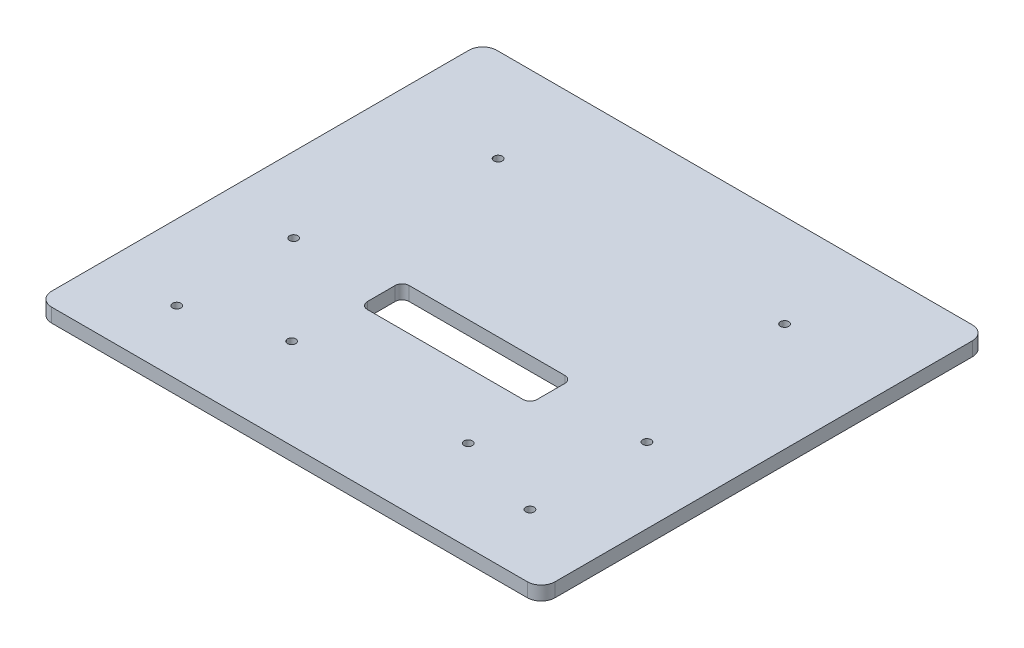
ISO-10303-21;
HEADER;
FILE_DESCRIPTION(('STEP AP214'),'2;1');
FILE_NAME('part.step','',(''),(''),'','','');
FILE_SCHEMA(('AUTOMOTIVE_DESIGN { 1 0 10303 214 1 1 1 1 }'));
ENDSEC;
DATA;
#1=APPLICATION_CONTEXT('core data for automotive mechanical design processes');
#2=APPLICATION_PROTOCOL_DEFINITION('international standard','automotive_design',2000,#1);
#3=PRODUCT_CONTEXT('',#1,'mechanical');
#4=PRODUCT('Part','Part','',(#3));
#5=PRODUCT_RELATED_PRODUCT_CATEGORY('part','',(#4));
#6=PRODUCT_DEFINITION_FORMATION('','',#4);
#7=PRODUCT_DEFINITION_CONTEXT('part definition',#1,'design');
#8=PRODUCT_DEFINITION('design','',#6,#7);
#9=PRODUCT_DEFINITION_SHAPE('','',#8);
#10=(LENGTH_UNIT() NAMED_UNIT(*) SI_UNIT(.MILLI.,.METRE.));
#11=(NAMED_UNIT(*) PLANE_ANGLE_UNIT() SI_UNIT($,.RADIAN.));
#12=(NAMED_UNIT(*) SI_UNIT($,.STERADIAN.) SOLID_ANGLE_UNIT());
#13=UNCERTAINTY_MEASURE_WITH_UNIT(LENGTH_MEASURE(1.E-05),#10,'distance_accuracy_value','');
#14=(GEOMETRIC_REPRESENTATION_CONTEXT(3) GLOBAL_UNCERTAINTY_ASSIGNED_CONTEXT((#13)) GLOBAL_UNIT_ASSIGNED_CONTEXT((#10,
#11,#12)) REPRESENTATION_CONTEXT('',''));
#15=CARTESIAN_POINT('',(0.,0.,0.));
#16=DIRECTION('',(0.,0.,1.));
#17=DIRECTION('',(1.,0.,0.));
#18=AXIS2_PLACEMENT_3D('',#15,#16,#17);
#19=CARTESIAN_POINT('',(109.134216211139,5.,-126.661644013292));
#20=DIRECTION('',(0.,-1.,0.));
#21=DIRECTION('',(0.,0.,-1.));
#22=AXIS2_PLACEMENT_3D('',#19,#20,#21);
#23=CYLINDRICAL_SURFACE('',#22,5.00000000000001);
#24=CARTESIAN_POINT('',(109.134216211139,0.,-126.661644013292));
#25=DIRECTION('',(0.,1.,0.));
#26=DIRECTION('',(0.,0.,-1.));
#27=AXIS2_PLACEMENT_3D('',#24,#25,#26);
#28=CIRCLE('',#27,5.00000000000001);
#29=CARTESIAN_POINT('',(114.134216211139,0.,-126.661644013292));
#30=VERTEX_POINT('',#29);
#31=CARTESIAN_POINT('',(109.134216211139,0.,-131.661644013292));
#32=VERTEX_POINT('',#31);
#33=EDGE_CURVE('E232',#30,#32,#28,.T.);
#34=ORIENTED_EDGE('',*,*,#33,.T.);
#35=DIRECTION('',(0.,-1.,0.));
#36=VECTOR('',#35,1.);
#37=CARTESIAN_POINT('',(109.134216211139,5.,-131.661644013292));
#38=LINE('',#37,#36);
#39=CARTESIAN_POINT('',(109.134216211139,5.,-131.661644013292));
#40=VERTEX_POINT('',#39);
#41=EDGE_CURVE('E289',#40,#32,#38,.T.);
#42=ORIENTED_EDGE('',*,*,#41,.F.);
#43=CARTESIAN_POINT('',(109.134216211139,5.,-126.661644013292));
#44=DIRECTION('',(0.,1.,0.));
#45=DIRECTION('',(0.,0.,-1.));
#46=AXIS2_PLACEMENT_3D('',#43,#44,#45);
#47=CIRCLE('',#46,5.00000000000001);
#48=CARTESIAN_POINT('',(114.134216211139,5.,-126.661644013292));
#49=VERTEX_POINT('',#48);
#50=EDGE_CURVE('E235',#49,#40,#47,.T.);
#51=ORIENTED_EDGE('',*,*,#50,.F.);
#52=DIRECTION('',(0.,-1.,0.));
#53=VECTOR('',#52,1.);
#54=CARTESIAN_POINT('',(114.134216211139,5.,-126.661644013292));
#55=LINE('',#54,#53);
#56=EDGE_CURVE('E253',#49,#30,#55,.T.);
#57=ORIENTED_EDGE('',*,*,#56,.T.);
#58=EDGE_LOOP('',(#34,#42,#51,#57));
#59=FACE_BOUND('',#58,.T.);
#60=ADVANCED_FACE('F35',(#59),#23,.T.);
#61=CARTESIAN_POINT('',(-61.8657837888607,5.,-131.661644013292));
#62=DIRECTION('',(0.,0.,1.));
#63=DIRECTION('',(1.,0.,0.));
#64=AXIS2_PLACEMENT_3D('',#61,#62,#63);
#65=PLANE('',#64);
#66=DIRECTION('',(-1.,0.,0.));
#67=VECTOR('',#66,1.);
#68=CARTESIAN_POINT('',(-61.8657837888607,0.,-131.661644013292));
#69=LINE('',#68,#67);
#70=CARTESIAN_POINT('',(-61.8657837888607,0.,-131.661644013292));
#71=VERTEX_POINT('',#70);
#72=EDGE_CURVE('E256',#32,#71,#69,.T.);
#73=ORIENTED_EDGE('',*,*,#72,.T.);
#74=DIRECTION('',(0.,-1.,0.));
#75=VECTOR('',#74,1.);
#76=CARTESIAN_POINT('',(-61.8657837888607,5.,-131.661644013292));
#77=LINE('',#76,#75);
#78=CARTESIAN_POINT('',(-61.8657837888607,5.,-131.661644013292));
#79=VERTEX_POINT('',#78);
#80=EDGE_CURVE('E286',#79,#71,#77,.T.);
#81=ORIENTED_EDGE('',*,*,#80,.F.);
#82=DIRECTION('',(-1.,0.,0.));
#83=VECTOR('',#82,1.);
#84=CARTESIAN_POINT('',(-61.8657837888607,5.,-131.661644013292));
#85=LINE('',#84,#83);
#86=EDGE_CURVE('E238',#40,#79,#85,.T.);
#87=ORIENTED_EDGE('',*,*,#86,.F.);
#88=ORIENTED_EDGE('',*,*,#41,.T.);
#89=EDGE_LOOP('',(#73,#81,#87,#88));
#90=FACE_BOUND('',#89,.T.);
#91=ADVANCED_FACE('F352',(#90),#65,.F.);
#92=CARTESIAN_POINT('',(-61.8657837888607,5.,-126.661644013292));
#93=DIRECTION('',(0.,-1.,0.));
#94=DIRECTION('',(0.,0.,-1.));
#95=AXIS2_PLACEMENT_3D('',#92,#93,#94);
#96=CYLINDRICAL_SURFACE('',#95,4.99999999999999);
#97=CARTESIAN_POINT('',(-61.8657837888607,0.,-126.661644013292));
#98=DIRECTION('',(0.,1.,0.));
#99=DIRECTION('',(0.,0.,1.));
#100=AXIS2_PLACEMENT_3D('',#97,#98,#99);
#101=CIRCLE('',#100,4.99999999999999);
#102=CARTESIAN_POINT('',(-66.8657837888607,0.,-126.661644013292));
#103=VERTEX_POINT('',#102);
#104=EDGE_CURVE('E258',#71,#103,#101,.T.);
#105=ORIENTED_EDGE('',*,*,#104,.T.);
#106=DIRECTION('',(0.,-1.,0.));
#107=VECTOR('',#106,1.);
#108=CARTESIAN_POINT('',(-66.8657837888607,5.,-126.661644013292));
#109=LINE('',#108,#107);
#110=CARTESIAN_POINT('',(-66.8657837888607,5.,-126.661644013292));
#111=VERTEX_POINT('',#110);
#112=EDGE_CURVE('E283',#111,#103,#109,.T.);
#113=ORIENTED_EDGE('',*,*,#112,.F.);
#114=CARTESIAN_POINT('',(-61.8657837888607,5.,-126.661644013292));
#115=DIRECTION('',(0.,1.,0.));
#116=DIRECTION('',(0.,0.,1.));
#117=AXIS2_PLACEMENT_3D('',#114,#115,#116);
#118=CIRCLE('',#117,4.99999999999999);
#119=EDGE_CURVE('E241',#79,#111,#118,.T.);
#120=ORIENTED_EDGE('',*,*,#119,.F.);
#121=ORIENTED_EDGE('',*,*,#80,.T.);
#122=EDGE_LOOP('',(#105,#113,#120,#121));
#123=FACE_BOUND('',#122,.T.);
#124=ADVANCED_FACE('F357',(#123),#96,.T.);
#125=CARTESIAN_POINT('',(-66.8657837888607,5.,-126.661644013292));
#126=DIRECTION('',(1.,0.,0.));
#127=DIRECTION('',(0.,0.,-1.));
#128=AXIS2_PLACEMENT_3D('',#125,#126,#127);
#129=PLANE('',#128);
#130=DIRECTION('',(0.,0.,1.));
#131=VECTOR('',#130,1.);
#132=CARTESIAN_POINT('',(-66.8657837888607,0.,-126.661644013292));
#133=LINE('',#132,#131);
#134=CARTESIAN_POINT('',(-66.8657837888607,0.,23.3383559867076));
#135=VERTEX_POINT('',#134);
#136=EDGE_CURVE('E260',#103,#135,#133,.T.);
#137=ORIENTED_EDGE('',*,*,#136,.T.);
#138=DIRECTION('',(0.,-1.,0.));
#139=VECTOR('',#138,1.);
#140=CARTESIAN_POINT('',(-66.8657837888607,5.,23.3383559867076));
#141=LINE('',#140,#139);
#142=CARTESIAN_POINT('',(-66.8657837888607,5.,23.3383559867076));
#143=VERTEX_POINT('',#142);
#144=EDGE_CURVE('E280',#143,#135,#141,.T.);
#145=ORIENTED_EDGE('',*,*,#144,.F.);
#146=DIRECTION('',(0.,0.,1.));
#147=VECTOR('',#146,1.);
#148=CARTESIAN_POINT('',(-66.8657837888607,5.,-126.661644013292));
#149=LINE('',#148,#147);
#150=EDGE_CURVE('E243',#111,#143,#149,.T.);
#151=ORIENTED_EDGE('',*,*,#150,.F.);
#152=ORIENTED_EDGE('',*,*,#112,.T.);
#153=EDGE_LOOP('',(#137,#145,#151,#152));
#154=FACE_BOUND('',#153,.T.);
#155=ADVANCED_FACE('F391',(#154),#129,.F.);
#156=CARTESIAN_POINT('',(-61.8657837888607,5.,23.3383559867076));
#157=DIRECTION('',(0.,-1.,0.));
#158=DIRECTION('',(0.,0.,-1.));
#159=AXIS2_PLACEMENT_3D('',#156,#157,#158);
#160=CYLINDRICAL_SURFACE('',#159,5.);
#161=CARTESIAN_POINT('',(-61.8657837888607,0.,23.3383559867076));
#162=DIRECTION('',(0.,1.,0.));
#163=DIRECTION('',(0.,0.,-1.));
#164=AXIS2_PLACEMENT_3D('',#161,#162,#163);
#165=CIRCLE('',#164,5.);
#166=CARTESIAN_POINT('',(-61.8657837888607,0.,28.3383559867076));
#167=VERTEX_POINT('',#166);
#168=EDGE_CURVE('E262',#135,#167,#165,.T.);
#169=ORIENTED_EDGE('',*,*,#168,.T.);
#170=DIRECTION('',(0.,-1.,0.));
#171=VECTOR('',#170,1.);
#172=CARTESIAN_POINT('',(-61.8657837888607,5.,28.3383559867076));
#173=LINE('',#172,#171);
#174=CARTESIAN_POINT('',(-61.8657837888607,5.,28.3383559867076));
#175=VERTEX_POINT('',#174);
#176=EDGE_CURVE('E277',#175,#167,#173,.T.);
#177=ORIENTED_EDGE('',*,*,#176,.F.);
#178=CARTESIAN_POINT('',(-61.8657837888607,5.,23.3383559867076));
#179=DIRECTION('',(0.,1.,0.));
#180=DIRECTION('',(0.,0.,-1.));
#181=AXIS2_PLACEMENT_3D('',#178,#179,#180);
#182=CIRCLE('',#181,5.);
#183=EDGE_CURVE('E245',#143,#175,#182,.T.);
#184=ORIENTED_EDGE('',*,*,#183,.F.);
#185=ORIENTED_EDGE('',*,*,#144,.T.);
#186=EDGE_LOOP('',(#169,#177,#184,#185));
#187=FACE_BOUND('',#186,.T.);
#188=ADVANCED_FACE('F387',(#187),#160,.T.);
#189=CARTESIAN_POINT('',(-61.8657837888607,5.,28.3383559867076));
#190=DIRECTION('',(0.,0.,-1.));
#191=DIRECTION('',(-1.,0.,0.));
#192=AXIS2_PLACEMENT_3D('',#189,#190,#191);
#193=PLANE('',#192);
#194=DIRECTION('',(1.,0.,0.));
#195=VECTOR('',#194,1.);
#196=CARTESIAN_POINT('',(-61.8657837888607,0.,28.3383559867076));
#197=LINE('',#196,#195);
#198=CARTESIAN_POINT('',(109.134216211139,0.,28.3383559867076));
#199=VERTEX_POINT('',#198);
#200=EDGE_CURVE('E264',#167,#199,#197,.T.);
#201=ORIENTED_EDGE('',*,*,#200,.T.);
#202=DIRECTION('',(0.,-1.,0.));
#203=VECTOR('',#202,1.);
#204=CARTESIAN_POINT('',(109.134216211139,5.,28.3383559867076));
#205=LINE('',#204,#203);
#206=CARTESIAN_POINT('',(109.134216211139,5.,28.3383559867076));
#207=VERTEX_POINT('',#206);
#208=EDGE_CURVE('E274',#207,#199,#205,.T.);
#209=ORIENTED_EDGE('',*,*,#208,.F.);
#210=DIRECTION('',(1.,0.,0.));
#211=VECTOR('',#210,1.);
#212=CARTESIAN_POINT('',(-61.8657837888607,5.,28.3383559867076));
#213=LINE('',#212,#211);
#214=EDGE_CURVE('E247',#175,#207,#213,.T.);
#215=ORIENTED_EDGE('',*,*,#214,.F.);
#216=ORIENTED_EDGE('',*,*,#176,.T.);
#217=EDGE_LOOP('',(#201,#209,#215,#216));
#218=FACE_BOUND('',#217,.T.);
#219=ADVANCED_FACE('F382',(#218),#193,.F.);
#220=CARTESIAN_POINT('',(109.134216211139,5.,23.3383559867076));
#221=DIRECTION('',(0.,-1.,0.));
#222=DIRECTION('',(0.,0.,-1.));
#223=AXIS2_PLACEMENT_3D('',#220,#221,#222);
#224=CYLINDRICAL_SURFACE('',#223,5.);
#225=CARTESIAN_POINT('',(109.134216211139,0.,23.3383559867076));
#226=DIRECTION('',(0.,1.,0.));
#227=DIRECTION('',(0.,0.,1.));
#228=AXIS2_PLACEMENT_3D('',#225,#226,#227);
#229=CIRCLE('',#228,5.);
#230=CARTESIAN_POINT('',(114.134216211139,0.,23.3383559867076));
#231=VERTEX_POINT('',#230);
#232=EDGE_CURVE('E266',#199,#231,#229,.T.);
#233=ORIENTED_EDGE('',*,*,#232,.T.);
#234=DIRECTION('',(0.,-1.,0.));
#235=VECTOR('',#234,1.);
#236=CARTESIAN_POINT('',(114.134216211139,5.,23.3383559867076));
#237=LINE('',#236,#235);
#238=CARTESIAN_POINT('',(114.134216211139,5.,23.3383559867076));
#239=VERTEX_POINT('',#238);
#240=EDGE_CURVE('E271',#239,#231,#237,.T.);
#241=ORIENTED_EDGE('',*,*,#240,.F.);
#242=CARTESIAN_POINT('',(109.134216211139,5.,23.3383559867076));
#243=DIRECTION('',(0.,1.,0.));
#244=DIRECTION('',(0.,0.,1.));
#245=AXIS2_PLACEMENT_3D('',#242,#243,#244);
#246=CIRCLE('',#245,5.);
#247=EDGE_CURVE('E249',#207,#239,#246,.T.);
#248=ORIENTED_EDGE('',*,*,#247,.F.);
#249=ORIENTED_EDGE('',*,*,#208,.T.);
#250=EDGE_LOOP('',(#233,#241,#248,#249));
#251=FACE_BOUND('',#250,.T.);
#252=ADVANCED_FACE('F377',(#251),#224,.T.);
#253=CARTESIAN_POINT('',(114.134216211139,5.,-126.661644013292));
#254=DIRECTION('',(-1.,0.,0.));
#255=DIRECTION('',(0.,0.,1.));
#256=AXIS2_PLACEMENT_3D('',#253,#254,#255);
#257=PLANE('',#256);
#258=DIRECTION('',(0.,0.,-1.));
#259=VECTOR('',#258,1.);
#260=CARTESIAN_POINT('',(114.134216211139,0.,-126.661644013292));
#261=LINE('',#260,#259);
#262=EDGE_CURVE('E239',#231,#30,#261,.T.);
#263=ORIENTED_EDGE('',*,*,#262,.T.);
#264=ORIENTED_EDGE('',*,*,#56,.F.);
#265=DIRECTION('',(0.,0.,-1.));
#266=VECTOR('',#265,1.);
#267=CARTESIAN_POINT('',(114.134216211139,5.,-126.661644013292));
#268=LINE('',#267,#266);
#269=EDGE_CURVE('E251',#239,#49,#268,.T.);
#270=ORIENTED_EDGE('',*,*,#269,.F.);
#271=ORIENTED_EDGE('',*,*,#240,.T.);
#272=EDGE_LOOP('',(#263,#264,#270,#271));
#273=FACE_BOUND('',#272,.T.);
#274=ADVANCED_FACE('F375',(#273),#257,.F.);
#275=CARTESIAN_POINT('',(109.134216211139,5.,-126.661644013292));
#276=DIRECTION('',(0.,-1.,0.));
#277=DIRECTION('',(0.,0.,-1.));
#278=AXIS2_PLACEMENT_3D('',#275,#276,#277);
#279=PLANE('',#278);
#280=DIRECTION('',(-1.,0.,0.));
#281=VECTOR('',#280,1.);
#282=CARTESIAN_POINT('',(-4.36578378886072,5.,-42.6616440132924));
#283=LINE('',#282,#281);
#284=CARTESIAN_POINT('',(51.6342162111393,5.,-42.6616440132924));
#285=VERTEX_POINT('',#284);
#286=CARTESIAN_POINT('',(-4.36578378886072,5.,-42.6616440132924));
#287=VERTEX_POINT('',#286);
#288=EDGE_CURVE('E158',#285,#287,#283,.T.);
#289=ORIENTED_EDGE('',*,*,#288,.F.);
#290=CARTESIAN_POINT('',(51.6342162111393,5.,-40.1616440132924));
#291=DIRECTION('',(0.,1.,0.));
#292=DIRECTION('',(0.,0.,1.));
#293=AXIS2_PLACEMENT_3D('',#290,#291,#292);
#294=CIRCLE('',#293,2.5);
#295=CARTESIAN_POINT('',(54.1342162111393,5.,-40.1616440132924));
#296=VERTEX_POINT('',#295);
#297=EDGE_CURVE('E49',#296,#285,#294,.T.);
#298=ORIENTED_EDGE('',*,*,#297,.F.);
#299=DIRECTION('',(0.,0.,-1.));
#300=VECTOR('',#299,1.);
#301=CARTESIAN_POINT('',(54.1342162111393,5.,-40.1616440132924));
#302=LINE('',#301,#300);
#303=CARTESIAN_POINT('',(54.1342162111393,5.,-30.1616440132924));
#304=VERTEX_POINT('',#303);
#305=EDGE_CURVE('E180',#304,#296,#302,.T.);
#306=ORIENTED_EDGE('',*,*,#305,.F.);
#307=CARTESIAN_POINT('',(51.6342162111393,5.,-30.1616440132924));
#308=DIRECTION('',(0.,1.,0.));
#309=DIRECTION('',(0.,0.,-1.));
#310=AXIS2_PLACEMENT_3D('',#307,#308,#309);
#311=CIRCLE('',#310,2.5);
#312=CARTESIAN_POINT('',(51.6342162111393,5.,-27.6616440132924));
#313=VERTEX_POINT('',#312);
#314=EDGE_CURVE('E177',#313,#304,#311,.T.);
#315=ORIENTED_EDGE('',*,*,#314,.F.);
#316=DIRECTION('',(1.,0.,0.));
#317=VECTOR('',#316,1.);
#318=CARTESIAN_POINT('',(-4.36578378886072,5.,-27.6616440132924));
#319=LINE('',#318,#317);
#320=CARTESIAN_POINT('',(-4.36578378886072,5.,-27.6616440132924));
#321=VERTEX_POINT('',#320);
#322=EDGE_CURVE('E174',#321,#313,#319,.T.);
#323=ORIENTED_EDGE('',*,*,#322,.F.);
#324=CARTESIAN_POINT('',(-4.36578378886074,5.,-30.1616440132924));
#325=DIRECTION('',(0.,1.,0.));
#326=DIRECTION('',(0.,0.,-1.));
#327=AXIS2_PLACEMENT_3D('',#324,#325,#326);
#328=CIRCLE('',#327,2.5);
#329=CARTESIAN_POINT('',(-6.86578378886074,5.,-30.1616440132924));
#330=VERTEX_POINT('',#329);
#331=EDGE_CURVE('E168',#330,#321,#328,.T.);
#332=ORIENTED_EDGE('',*,*,#331,.F.);
#333=DIRECTION('',(0.,0.,1.));
#334=VECTOR('',#333,1.);
#335=CARTESIAN_POINT('',(-6.86578378886074,5.,-40.1616440132924));
#336=LINE('',#335,#334);
#337=CARTESIAN_POINT('',(-6.86578378886074,5.,-40.1616440132924));
#338=VERTEX_POINT('',#337);
#339=EDGE_CURVE('E166',#338,#330,#336,.T.);
#340=ORIENTED_EDGE('',*,*,#339,.F.);
#341=CARTESIAN_POINT('',(-4.36578378886074,5.,-40.1616440132924));
#342=DIRECTION('',(0.,1.,0.));
#343=DIRECTION('',(0.,0.,1.));
#344=AXIS2_PLACEMENT_3D('',#341,#342,#343);
#345=CIRCLE('',#344,2.5);
#346=EDGE_CURVE('E149',#287,#338,#345,.T.);
#347=ORIENTED_EDGE('',*,*,#346,.F.);
#348=EDGE_LOOP('',(#289,#298,#306,#315,#323,#332,#340,#347));
#349=FACE_BOUND('',#348,.T.);
#350=CARTESIAN_POINT('',(-39.8657837888607,5.,5.38835598670764));
#351=DIRECTION('',(0.,1.,0.));
#352=DIRECTION('',(0.,0.,1.));
#353=AXIS2_PLACEMENT_3D('',#350,#351,#352);
#354=CIRCLE('',#353,1.5);
#355=CARTESIAN_POINT('',(-39.8657837888607,5.,6.88835598670764));
#356=VERTEX_POINT('',#355);
#357=EDGE_CURVE('E196',#356,#356,#354,.T.);
#358=ORIENTED_EDGE('',*,*,#357,.F.);
#359=EDGE_LOOP('',(#358));
#360=FACE_BOUND('',#359,.T.);
#361=CARTESIAN_POINT('',(87.1342162111393,5.,-36.6616440132924));
#362=DIRECTION('',(0.,1.,0.));
#363=DIRECTION('',(0.,0.,1.));
#364=AXIS2_PLACEMENT_3D('',#361,#362,#363);
#365=CIRCLE('',#364,1.5);
#366=CARTESIAN_POINT('',(87.1342162111393,5.,-35.1616440132924));
#367=VERTEX_POINT('',#366);
#368=EDGE_CURVE('E200',#367,#367,#365,.T.);
#369=ORIENTED_EDGE('',*,*,#368,.F.);
#370=EDGE_LOOP('',(#369));
#371=FACE_BOUND('',#370,.T.);
#372=CARTESIAN_POINT('',(87.1342162111393,5.,5.38835598670764));
#373=DIRECTION('',(0.,1.,0.));
#374=DIRECTION('',(0.,0.,1.));
#375=AXIS2_PLACEMENT_3D('',#372,#373,#374);
#376=CIRCLE('',#375,1.5);
#377=CARTESIAN_POINT('',(87.1342162111393,5.,6.88835598670763));
#378=VERTEX_POINT('',#377);
#379=EDGE_CURVE('E185',#378,#378,#376,.T.);
#380=ORIENTED_EDGE('',*,*,#379,.F.);
#381=EDGE_LOOP('',(#380));
#382=FACE_BOUND('',#381,.T.);
#383=CARTESIAN_POINT('',(-39.8657837888607,5.,-36.6616440132924));
#384=DIRECTION('',(0.,1.,0.));
#385=DIRECTION('',(0.,0.,1.));
#386=AXIS2_PLACEMENT_3D('',#383,#384,#385);
#387=CIRCLE('',#386,1.5);
#388=CARTESIAN_POINT('',(-39.8657837888607,5.,-35.1616440132924));
#389=VERTEX_POINT('',#388);
#390=EDGE_CURVE('E205',#389,#389,#387,.T.);
#391=ORIENTED_EDGE('',*,*,#390,.F.);
#392=EDGE_LOOP('',(#391));
#393=FACE_BOUND('',#392,.T.);
#394=CARTESIAN_POINT('',(75.1342162111393,5.,-98.1616440132924));
#395=DIRECTION('',(0.,1.,0.));
#396=DIRECTION('',(0.,0.,1.));
#397=AXIS2_PLACEMENT_3D('',#394,#395,#396);
#398=CIRCLE('',#397,1.5);
#399=CARTESIAN_POINT('',(75.1342162111393,5.,-96.6616440132924));
#400=VERTEX_POINT('',#399);
#401=EDGE_CURVE('E214',#400,#400,#398,.T.);
#402=ORIENTED_EDGE('',*,*,#401,.F.);
#403=EDGE_LOOP('',(#402));
#404=FACE_BOUND('',#403,.T.);
#405=CARTESIAN_POINT('',(-8.11578378886073,5.,-4.16164401329237));
#406=DIRECTION('',(0.,1.,0.));
#407=DIRECTION('',(0.,0.,1.));
#408=AXIS2_PLACEMENT_3D('',#405,#406,#407);
#409=CIRCLE('',#408,1.5);
#410=CARTESIAN_POINT('',(-8.11578378886073,5.,-2.66164401329237));
#411=VERTEX_POINT('',#410);
#412=EDGE_CURVE('E220',#411,#411,#409,.T.);
#413=ORIENTED_EDGE('',*,*,#412,.F.);
#414=EDGE_LOOP('',(#413));
#415=FACE_BOUND('',#414,.T.);
#416=CARTESIAN_POINT('',(55.3842162111393,5.,-4.16164401329237));
#417=DIRECTION('',(0.,1.,0.));
#418=DIRECTION('',(0.,0.,1.));
#419=AXIS2_PLACEMENT_3D('',#416,#417,#418);
#420=CIRCLE('',#419,1.5);
#421=CARTESIAN_POINT('',(55.3842162111393,5.,-2.66164401329237));
#422=VERTEX_POINT('',#421);
#423=EDGE_CURVE('E226',#422,#422,#420,.T.);
#424=ORIENTED_EDGE('',*,*,#423,.F.);
#425=EDGE_LOOP('',(#424));
#426=FACE_BOUND('',#425,.T.);
#427=CARTESIAN_POINT('',(-27.8657837888607,5.,-98.1616440132924));
#428=DIRECTION('',(0.,1.,0.));
#429=DIRECTION('',(0.,0.,1.));
#430=AXIS2_PLACEMENT_3D('',#427,#428,#429);
#431=CIRCLE('',#430,1.5);
#432=CARTESIAN_POINT('',(-27.8657837888607,5.,-96.6616440132924));
#433=VERTEX_POINT('',#432);
#434=EDGE_CURVE('E213',#433,#433,#431,.T.);
#435=ORIENTED_EDGE('',*,*,#434,.F.);
#436=EDGE_LOOP('',(#435));
#437=FACE_BOUND('',#436,.T.);
#438=ORIENTED_EDGE('',*,*,#50,.T.);
#439=ORIENTED_EDGE('',*,*,#86,.T.);
#440=ORIENTED_EDGE('',*,*,#119,.T.);
#441=ORIENTED_EDGE('',*,*,#150,.T.);
#442=ORIENTED_EDGE('',*,*,#183,.T.);
#443=ORIENTED_EDGE('',*,*,#214,.T.);
#444=ORIENTED_EDGE('',*,*,#247,.T.);
#445=ORIENTED_EDGE('',*,*,#269,.T.);
#446=EDGE_LOOP('',(#438,#439,#440,#441,#442,#443,#444,#445));
#447=FACE_BOUND('',#446,.T.);
#448=ADVANCED_FACE('F162',(#349,#360,#371,#382,#393,#404,#415,#426,#437,#447),#279,.F.);
#449=CARTESIAN_POINT('',(109.134216211139,0.,-126.661644013292));
#450=DIRECTION('',(0.,-1.,0.));
#451=DIRECTION('',(0.,0.,-1.));
#452=AXIS2_PLACEMENT_3D('',#449,#450,#451);
#453=PLANE('',#452);
#454=CARTESIAN_POINT('',(51.6342162111393,0.,-40.1616440132924));
#455=DIRECTION('',(0.,-1.,0.));
#456=DIRECTION('',(0.,0.,-1.));
#457=AXIS2_PLACEMENT_3D('',#454,#455,#456);
#458=CIRCLE('',#457,2.5);
#459=CARTESIAN_POINT('',(51.6342162111393,0.,-42.6616440132924));
#460=VERTEX_POINT('',#459);
#461=CARTESIAN_POINT('',(54.1342162111393,0.,-40.1616440132924));
#462=VERTEX_POINT('',#461);
#463=EDGE_CURVE('E11',#460,#462,#458,.T.);
#464=ORIENTED_EDGE('',*,*,#463,.F.);
#465=DIRECTION('',(1.,0.,0.));
#466=VECTOR('',#465,1.);
#467=CARTESIAN_POINT('',(109.134216211139,0.,-42.6616440132924));
#468=LINE('',#467,#466);
#469=CARTESIAN_POINT('',(-4.36578378886072,0.,-42.6616440132924));
#470=VERTEX_POINT('',#469);
#471=EDGE_CURVE('E292',#470,#460,#468,.T.);
#472=ORIENTED_EDGE('',*,*,#471,.F.);
#473=CARTESIAN_POINT('',(-4.36578378886074,0.,-40.1616440132924));
#474=DIRECTION('',(0.,-1.,0.));
#475=DIRECTION('',(0.,0.,-1.));
#476=AXIS2_PLACEMENT_3D('',#473,#474,#475);
#477=CIRCLE('',#476,2.5);
#478=CARTESIAN_POINT('',(-6.86578378886074,0.,-40.1616440132924));
#479=VERTEX_POINT('',#478);
#480=EDGE_CURVE('E152',#479,#470,#477,.T.);
#481=ORIENTED_EDGE('',*,*,#480,.F.);
#482=DIRECTION('',(0.,0.,-1.));
#483=VECTOR('',#482,1.);
#484=CARTESIAN_POINT('',(-6.86578378886075,0.,-126.661644013292));
#485=LINE('',#484,#483);
#486=CARTESIAN_POINT('',(-6.86578378886074,0.,-30.1616440132924));
#487=VERTEX_POINT('',#486);
#488=EDGE_CURVE('E304',#487,#479,#485,.T.);
#489=ORIENTED_EDGE('',*,*,#488,.F.);
#490=CARTESIAN_POINT('',(-4.36578378886074,0.,-30.1616440132924));
#491=DIRECTION('',(0.,-1.,0.));
#492=DIRECTION('',(0.,0.,-1.));
#493=AXIS2_PLACEMENT_3D('',#490,#491,#492);
#494=CIRCLE('',#493,2.5);
#495=CARTESIAN_POINT('',(-4.36578378886072,0.,-27.6616440132924));
#496=VERTEX_POINT('',#495);
#497=EDGE_CURVE('E306',#496,#487,#494,.T.);
#498=ORIENTED_EDGE('',*,*,#497,.F.);
#499=DIRECTION('',(-1.,0.,0.));
#500=VECTOR('',#499,1.);
#501=CARTESIAN_POINT('',(109.134216211139,0.,-27.6616440132924));
#502=LINE('',#501,#500);
#503=CARTESIAN_POINT('',(51.6342162111393,0.,-27.6616440132924));
#504=VERTEX_POINT('',#503);
#505=EDGE_CURVE('E308',#504,#496,#502,.T.);
#506=ORIENTED_EDGE('',*,*,#505,.F.);
#507=CARTESIAN_POINT('',(51.6342162111393,0.,-30.1616440132924));
#508=DIRECTION('',(0.,-1.,0.));
#509=DIRECTION('',(0.,0.,-1.));
#510=AXIS2_PLACEMENT_3D('',#507,#508,#509);
#511=CIRCLE('',#510,2.5);
#512=CARTESIAN_POINT('',(54.1342162111393,0.,-30.1616440132924));
#513=VERTEX_POINT('',#512);
#514=EDGE_CURVE('E310',#513,#504,#511,.T.);
#515=ORIENTED_EDGE('',*,*,#514,.F.);
#516=DIRECTION('',(0.,0.,1.));
#517=VECTOR('',#516,1.);
#518=CARTESIAN_POINT('',(54.1342162111393,0.,-126.661644013292));
#519=LINE('',#518,#517);
#520=EDGE_CURVE('E42',#462,#513,#519,.T.);
#521=ORIENTED_EDGE('',*,*,#520,.F.);
#522=EDGE_LOOP('',(#464,#472,#481,#489,#498,#506,#515,#521));
#523=FACE_BOUND('',#522,.T.);
#524=CARTESIAN_POINT('',(-39.8657837888607,0.,5.38835598670764));
#525=DIRECTION('',(0.,-1.,0.));
#526=DIRECTION('',(0.,0.,-1.));
#527=AXIS2_PLACEMENT_3D('',#524,#525,#526);
#528=CIRCLE('',#527,1.5);
#529=CARTESIAN_POINT('',(-39.8657837888607,0.,3.88835598670763));
#530=VERTEX_POINT('',#529);
#531=EDGE_CURVE('E209',#530,#530,#528,.T.);
#532=ORIENTED_EDGE('',*,*,#531,.F.);
#533=EDGE_LOOP('',(#532));
#534=FACE_BOUND('',#533,.T.);
#535=CARTESIAN_POINT('',(87.1342162111393,0.,-36.6616440132924));
#536=DIRECTION('',(0.,-1.,0.));
#537=DIRECTION('',(0.,0.,-1.));
#538=AXIS2_PLACEMENT_3D('',#535,#536,#537);
#539=CIRCLE('',#538,1.5);
#540=CARTESIAN_POINT('',(87.1342162111393,0.,-38.1616440132924));
#541=VERTEX_POINT('',#540);
#542=EDGE_CURVE('E297',#541,#541,#539,.T.);
#543=ORIENTED_EDGE('',*,*,#542,.F.);
#544=EDGE_LOOP('',(#543));
#545=FACE_BOUND('',#544,.T.);
#546=CARTESIAN_POINT('',(87.1342162111393,0.,5.38835598670764));
#547=DIRECTION('',(0.,-1.,0.));
#548=DIRECTION('',(0.,0.,-1.));
#549=AXIS2_PLACEMENT_3D('',#546,#547,#548);
#550=CIRCLE('',#549,1.5);
#551=CARTESIAN_POINT('',(87.1342162111393,0.,3.88835598670764));
#552=VERTEX_POINT('',#551);
#553=EDGE_CURVE('E199',#552,#552,#550,.T.);
#554=ORIENTED_EDGE('',*,*,#553,.F.);
#555=EDGE_LOOP('',(#554));
#556=FACE_BOUND('',#555,.T.);
#557=CARTESIAN_POINT('',(-39.8657837888607,0.,-36.6616440132924));
#558=DIRECTION('',(0.,-1.,0.));
#559=DIRECTION('',(0.,0.,-1.));
#560=AXIS2_PLACEMENT_3D('',#557,#558,#559);
#561=CIRCLE('',#560,1.5);
#562=CARTESIAN_POINT('',(-39.8657837888607,0.,-38.1616440132924));
#563=VERTEX_POINT('',#562);
#564=EDGE_CURVE('E208',#563,#563,#561,.T.);
#565=ORIENTED_EDGE('',*,*,#564,.F.);
#566=EDGE_LOOP('',(#565));
#567=FACE_BOUND('',#566,.T.);
#568=CARTESIAN_POINT('',(75.1342162111393,0.,-98.1616440132924));
#569=DIRECTION('',(0.,1.,0.));
#570=DIRECTION('',(0.,0.,1.));
#571=AXIS2_PLACEMENT_3D('',#568,#569,#570);
#572=CIRCLE('',#571,1.5);
#573=CARTESIAN_POINT('',(75.1342162111393,0.,-96.6616440132924));
#574=VERTEX_POINT('',#573);
#575=EDGE_CURVE('E210',#574,#574,#572,.T.);
#576=ORIENTED_EDGE('',*,*,#575,.T.);
#577=EDGE_LOOP('',(#576));
#578=FACE_BOUND('',#577,.T.);
#579=CARTESIAN_POINT('',(-8.11578378886073,0.,-4.16164401329237));
#580=DIRECTION('',(0.,1.,0.));
#581=DIRECTION('',(0.,0.,1.));
#582=AXIS2_PLACEMENT_3D('',#579,#580,#581);
#583=CIRCLE('',#582,1.5);
#584=CARTESIAN_POINT('',(-8.11578378886073,0.,-2.66164401329237));
#585=VERTEX_POINT('',#584);
#586=EDGE_CURVE('E217',#585,#585,#583,.T.);
#587=ORIENTED_EDGE('',*,*,#586,.T.);
#588=EDGE_LOOP('',(#587));
#589=FACE_BOUND('',#588,.T.);
#590=CARTESIAN_POINT('',(55.3842162111393,0.,-4.16164401329237));
#591=DIRECTION('',(0.,1.,0.));
#592=DIRECTION('',(0.,0.,1.));
#593=AXIS2_PLACEMENT_3D('',#590,#591,#592);
#594=CIRCLE('',#593,1.5);
#595=CARTESIAN_POINT('',(55.3842162111393,0.,-2.66164401329237));
#596=VERTEX_POINT('',#595);
#597=EDGE_CURVE('E223',#596,#596,#594,.T.);
#598=ORIENTED_EDGE('',*,*,#597,.T.);
#599=EDGE_LOOP('',(#598));
#600=FACE_BOUND('',#599,.T.);
#601=CARTESIAN_POINT('',(-27.8657837888607,0.,-98.1616440132924));
#602=DIRECTION('',(0.,1.,0.));
#603=DIRECTION('',(0.,0.,1.));
#604=AXIS2_PLACEMENT_3D('',#601,#602,#603);
#605=CIRCLE('',#604,1.5);
#606=CARTESIAN_POINT('',(-27.8657837888607,0.,-96.6616440132924));
#607=VERTEX_POINT('',#606);
#608=EDGE_CURVE('E229',#607,#607,#605,.T.);
#609=ORIENTED_EDGE('',*,*,#608,.T.);
#610=EDGE_LOOP('',(#609));
#611=FACE_BOUND('',#610,.T.);
#612=ORIENTED_EDGE('',*,*,#33,.F.);
#613=ORIENTED_EDGE('',*,*,#262,.F.);
#614=ORIENTED_EDGE('',*,*,#232,.F.);
#615=ORIENTED_EDGE('',*,*,#200,.F.);
#616=ORIENTED_EDGE('',*,*,#168,.F.);
#617=ORIENTED_EDGE('',*,*,#136,.F.);
#618=ORIENTED_EDGE('',*,*,#104,.F.);
#619=ORIENTED_EDGE('',*,*,#72,.F.);
#620=EDGE_LOOP('',(#612,#613,#614,#615,#616,#617,#618,#619));
#621=FACE_BOUND('',#620,.T.);
#622=ADVANCED_FACE('F325',(#523,#534,#545,#556,#567,#578,#589,#600,#611,#621),#453,.T.);
#623=CARTESIAN_POINT('',(-27.8657837888607,0.,-98.1616440132924));
#624=DIRECTION('',(0.,1.,0.));
#625=DIRECTION('',(0.,0.,1.));
#626=AXIS2_PLACEMENT_3D('',#623,#624,#625);
#627=CYLINDRICAL_SURFACE('',#626,1.5);
#628=ORIENTED_EDGE('',*,*,#608,.F.);
#629=EDGE_LOOP('',(#628));
#630=FACE_BOUND('',#629,.T.);
#631=ORIENTED_EDGE('',*,*,#434,.T.);
#632=EDGE_LOOP('',(#631));
#633=FACE_BOUND('',#632,.T.);
#634=ADVANCED_FACE('F411',(#630,#633),#627,.F.);
#635=CARTESIAN_POINT('',(55.3842162111393,0.,-4.16164401329237));
#636=DIRECTION('',(0.,1.,0.));
#637=DIRECTION('',(0.,0.,1.));
#638=AXIS2_PLACEMENT_3D('',#635,#636,#637);
#639=CYLINDRICAL_SURFACE('',#638,1.5);
#640=ORIENTED_EDGE('',*,*,#597,.F.);
#641=EDGE_LOOP('',(#640));
#642=FACE_BOUND('',#641,.T.);
#643=ORIENTED_EDGE('',*,*,#423,.T.);
#644=EDGE_LOOP('',(#643));
#645=FACE_BOUND('',#644,.T.);
#646=ADVANCED_FACE('F416',(#642,#645),#639,.F.);
#647=CARTESIAN_POINT('',(-8.11578378886073,0.,-4.16164401329237));
#648=DIRECTION('',(0.,1.,0.));
#649=DIRECTION('',(0.,0.,1.));
#650=AXIS2_PLACEMENT_3D('',#647,#648,#649);
#651=CYLINDRICAL_SURFACE('',#650,1.5);
#652=ORIENTED_EDGE('',*,*,#586,.F.);
#653=EDGE_LOOP('',(#652));
#654=FACE_BOUND('',#653,.T.);
#655=ORIENTED_EDGE('',*,*,#412,.T.);
#656=EDGE_LOOP('',(#655));
#657=FACE_BOUND('',#656,.T.);
#658=ADVANCED_FACE('F420',(#654,#657),#651,.F.);
#659=CARTESIAN_POINT('',(75.1342162111393,0.,-98.1616440132924));
#660=DIRECTION('',(0.,1.,0.));
#661=DIRECTION('',(0.,0.,1.));
#662=AXIS2_PLACEMENT_3D('',#659,#660,#661);
#663=CYLINDRICAL_SURFACE('',#662,1.5);
#664=ORIENTED_EDGE('',*,*,#575,.F.);
#665=EDGE_LOOP('',(#664));
#666=FACE_BOUND('',#665,.T.);
#667=ORIENTED_EDGE('',*,*,#401,.T.);
#668=EDGE_LOOP('',(#667));
#669=FACE_BOUND('',#668,.T.);
#670=ADVANCED_FACE('F424',(#666,#669),#663,.F.);
#671=CARTESIAN_POINT('',(-39.8657837888607,-5.,-36.6616440132924));
#672=DIRECTION('',(0.,1.,0.));
#673=DIRECTION('',(0.,0.,1.));
#674=AXIS2_PLACEMENT_3D('',#671,#672,#673);
#675=CYLINDRICAL_SURFACE('',#674,1.5);
#676=ORIENTED_EDGE('',*,*,#564,.T.);
#677=EDGE_LOOP('',(#676));
#678=FACE_BOUND('',#677,.T.);
#679=ORIENTED_EDGE('',*,*,#390,.T.);
#680=EDGE_LOOP('',(#679));
#681=FACE_BOUND('',#680,.T.);
#682=ADVANCED_FACE('F428',(#678,#681),#675,.F.);
#683=CARTESIAN_POINT('',(87.1342162111393,-5.,5.38835598670764));
#684=DIRECTION('',(0.,1.,0.));
#685=DIRECTION('',(0.,0.,1.));
#686=AXIS2_PLACEMENT_3D('',#683,#684,#685);
#687=CYLINDRICAL_SURFACE('',#686,1.5);
#688=ORIENTED_EDGE('',*,*,#553,.T.);
#689=EDGE_LOOP('',(#688));
#690=FACE_BOUND('',#689,.T.);
#691=ORIENTED_EDGE('',*,*,#379,.T.);
#692=EDGE_LOOP('',(#691));
#693=FACE_BOUND('',#692,.T.);
#694=ADVANCED_FACE('F432',(#690,#693),#687,.F.);
#695=CARTESIAN_POINT('',(87.1342162111393,-5.,-36.6616440132924));
#696=DIRECTION('',(0.,1.,0.));
#697=DIRECTION('',(0.,0.,1.));
#698=AXIS2_PLACEMENT_3D('',#695,#696,#697);
#699=CYLINDRICAL_SURFACE('',#698,1.5);
#700=ORIENTED_EDGE('',*,*,#542,.T.);
#701=EDGE_LOOP('',(#700));
#702=FACE_BOUND('',#701,.T.);
#703=ORIENTED_EDGE('',*,*,#368,.T.);
#704=EDGE_LOOP('',(#703));
#705=FACE_BOUND('',#704,.T.);
#706=ADVANCED_FACE('F347',(#702,#705),#699,.F.);
#707=CARTESIAN_POINT('',(-39.8657837888607,-5.,5.38835598670764));
#708=DIRECTION('',(0.,1.,0.));
#709=DIRECTION('',(0.,0.,1.));
#710=AXIS2_PLACEMENT_3D('',#707,#708,#709);
#711=CYLINDRICAL_SURFACE('',#710,1.5);
#712=ORIENTED_EDGE('',*,*,#531,.T.);
#713=EDGE_LOOP('',(#712));
#714=FACE_BOUND('',#713,.T.);
#715=ORIENTED_EDGE('',*,*,#357,.T.);
#716=EDGE_LOOP('',(#715));
#717=FACE_BOUND('',#716,.T.);
#718=ADVANCED_FACE('F340',(#714,#717),#711,.F.);
#719=CARTESIAN_POINT('',(51.6342162111393,-5.,-40.1616440132924));
#720=DIRECTION('',(0.,1.,0.));
#721=DIRECTION('',(0.,0.,1.));
#722=AXIS2_PLACEMENT_3D('',#719,#720,#721);
#723=CYLINDRICAL_SURFACE('',#722,2.5);
#724=ORIENTED_EDGE('',*,*,#463,.T.);
#725=DIRECTION('',(0.,1.,0.));
#726=VECTOR('',#725,1.);
#727=CARTESIAN_POINT('',(54.1342162111393,-5.,-40.1616440132924));
#728=LINE('',#727,#726);
#729=EDGE_CURVE('E183',#462,#296,#728,.T.);
#730=ORIENTED_EDGE('',*,*,#729,.T.);
#731=ORIENTED_EDGE('',*,*,#297,.T.);
#732=DIRECTION('',(0.,1.,0.));
#733=VECTOR('',#732,1.);
#734=CARTESIAN_POINT('',(51.6342162111393,-5.,-42.6616440132924));
#735=LINE('',#734,#733);
#736=EDGE_CURVE('E155',#460,#285,#735,.T.);
#737=ORIENTED_EDGE('',*,*,#736,.F.);
#738=EDGE_LOOP('',(#724,#730,#731,#737));
#739=FACE_BOUND('',#738,.T.);
#740=ADVANCED_FACE('F338',(#739),#723,.F.);
#741=CARTESIAN_POINT('',(54.1342162111393,-5.,-40.1616440132924));
#742=DIRECTION('',(1.,0.,0.));
#743=DIRECTION('',(0.,0.,-1.));
#744=AXIS2_PLACEMENT_3D('',#741,#742,#743);
#745=PLANE('',#744);
#746=ORIENTED_EDGE('',*,*,#520,.T.);
#747=DIRECTION('',(0.,1.,0.));
#748=VECTOR('',#747,1.);
#749=CARTESIAN_POINT('',(54.1342162111393,-5.,-30.1616440132924));
#750=LINE('',#749,#748);
#751=EDGE_CURVE('E186',#513,#304,#750,.T.);
#752=ORIENTED_EDGE('',*,*,#751,.T.);
#753=ORIENTED_EDGE('',*,*,#305,.T.);
#754=ORIENTED_EDGE('',*,*,#729,.F.);
#755=EDGE_LOOP('',(#746,#752,#753,#754));
#756=FACE_BOUND('',#755,.T.);
#757=ADVANCED_FACE('F315',(#756),#745,.F.);
#758=CARTESIAN_POINT('',(51.6342162111393,-5.,-30.1616440132924));
#759=DIRECTION('',(0.,1.,0.));
#760=DIRECTION('',(0.,0.,1.));
#761=AXIS2_PLACEMENT_3D('',#758,#759,#760);
#762=CYLINDRICAL_SURFACE('',#761,2.5);
#763=ORIENTED_EDGE('',*,*,#514,.T.);
#764=DIRECTION('',(0.,1.,0.));
#765=VECTOR('',#764,1.);
#766=CARTESIAN_POINT('',(51.6342162111393,-5.,-27.6616440132924));
#767=LINE('',#766,#765);
#768=EDGE_CURVE('E188',#504,#313,#767,.T.);
#769=ORIENTED_EDGE('',*,*,#768,.T.);
#770=ORIENTED_EDGE('',*,*,#314,.T.);
#771=ORIENTED_EDGE('',*,*,#751,.F.);
#772=EDGE_LOOP('',(#763,#769,#770,#771));
#773=FACE_BOUND('',#772,.T.);
#774=ADVANCED_FACE('F320',(#773),#762,.F.);
#775=CARTESIAN_POINT('',(-4.36578378886072,-5.,-27.6616440132924));
#776=DIRECTION('',(0.,0.,1.));
#777=DIRECTION('',(1.,0.,0.));
#778=AXIS2_PLACEMENT_3D('',#775,#776,#777);
#779=PLANE('',#778);
#780=ORIENTED_EDGE('',*,*,#505,.T.);
#781=DIRECTION('',(0.,1.,0.));
#782=VECTOR('',#781,1.);
#783=CARTESIAN_POINT('',(-4.36578378886072,-5.,-27.6616440132924));
#784=LINE('',#783,#782);
#785=EDGE_CURVE('E190',#496,#321,#784,.T.);
#786=ORIENTED_EDGE('',*,*,#785,.T.);
#787=ORIENTED_EDGE('',*,*,#322,.T.);
#788=ORIENTED_EDGE('',*,*,#768,.F.);
#789=EDGE_LOOP('',(#780,#786,#787,#788));
#790=FACE_BOUND('',#789,.T.);
#791=ADVANCED_FACE('F331',(#790),#779,.F.);
#792=CARTESIAN_POINT('',(-4.36578378886074,-5.,-30.1616440132924));
#793=DIRECTION('',(0.,1.,0.));
#794=DIRECTION('',(0.,0.,1.));
#795=AXIS2_PLACEMENT_3D('',#792,#793,#794);
#796=CYLINDRICAL_SURFACE('',#795,2.5);
#797=ORIENTED_EDGE('',*,*,#497,.T.);
#798=DIRECTION('',(0.,1.,0.));
#799=VECTOR('',#798,1.);
#800=CARTESIAN_POINT('',(-6.86578378886074,-5.,-30.1616440132924));
#801=LINE('',#800,#799);
#802=EDGE_CURVE('E192',#487,#330,#801,.T.);
#803=ORIENTED_EDGE('',*,*,#802,.T.);
#804=ORIENTED_EDGE('',*,*,#331,.T.);
#805=ORIENTED_EDGE('',*,*,#785,.F.);
#806=EDGE_LOOP('',(#797,#803,#804,#805));
#807=FACE_BOUND('',#806,.T.);
#808=ADVANCED_FACE('F333',(#807),#796,.F.);
#809=CARTESIAN_POINT('',(-6.86578378886074,-5.,-40.1616440132924));
#810=DIRECTION('',(-1.,0.,0.));
#811=DIRECTION('',(0.,0.,1.));
#812=AXIS2_PLACEMENT_3D('',#809,#810,#811);
#813=PLANE('',#812);
#814=ORIENTED_EDGE('',*,*,#488,.T.);
#815=DIRECTION('',(0.,1.,0.));
#816=VECTOR('',#815,1.);
#817=CARTESIAN_POINT('',(-6.86578378886074,-5.,-40.1616440132924));
#818=LINE('',#817,#816);
#819=EDGE_CURVE('E154',#479,#338,#818,.T.);
#820=ORIENTED_EDGE('',*,*,#819,.T.);
#821=ORIENTED_EDGE('',*,*,#339,.T.);
#822=ORIENTED_EDGE('',*,*,#802,.F.);
#823=EDGE_LOOP('',(#814,#820,#821,#822));
#824=FACE_BOUND('',#823,.T.);
#825=ADVANCED_FACE('F337',(#824),#813,.F.);
#826=CARTESIAN_POINT('',(-4.36578378886074,-5.,-40.1616440132924));
#827=DIRECTION('',(0.,1.,0.));
#828=DIRECTION('',(0.,0.,1.));
#829=AXIS2_PLACEMENT_3D('',#826,#827,#828);
#830=CYLINDRICAL_SURFACE('',#829,2.5);
#831=ORIENTED_EDGE('',*,*,#480,.T.);
#832=DIRECTION('',(0.,1.,0.));
#833=VECTOR('',#832,1.);
#834=CARTESIAN_POINT('',(-4.36578378886072,-5.,-42.6616440132924));
#835=LINE('',#834,#833);
#836=EDGE_CURVE('E57',#470,#287,#835,.T.);
#837=ORIENTED_EDGE('',*,*,#836,.T.);
#838=ORIENTED_EDGE('',*,*,#346,.T.);
#839=ORIENTED_EDGE('',*,*,#819,.F.);
#840=EDGE_LOOP('',(#831,#837,#838,#839));
#841=FACE_BOUND('',#840,.T.);
#842=ADVANCED_FACE('F146',(#841),#830,.F.);
#843=CARTESIAN_POINT('',(-4.36578378886072,-5.,-42.6616440132924));
#844=DIRECTION('',(0.,0.,-1.));
#845=DIRECTION('',(-1.,0.,0.));
#846=AXIS2_PLACEMENT_3D('',#843,#844,#845);
#847=PLANE('',#846);
#848=ORIENTED_EDGE('',*,*,#471,.T.);
#849=ORIENTED_EDGE('',*,*,#736,.T.);
#850=ORIENTED_EDGE('',*,*,#288,.T.);
#851=ORIENTED_EDGE('',*,*,#836,.F.);
#852=EDGE_LOOP('',(#848,#849,#850,#851));
#853=FACE_BOUND('',#852,.T.);
#854=ADVANCED_FACE('F159',(#853),#847,.F.);
#855=CLOSED_SHELL('',(#60,#91,#124,#155,#188,#219,#252,#274,#448,#622,#634,#646,#658,#670,#682,
#694,#706,#718,#740,#757,#774,#791,#808,#825,#842,#854));
#856=MANIFOLD_SOLID_BREP('B2',#855);
#857=ADVANCED_BREP_SHAPE_REPRESENTATION('',(#18,#856),#14);
#858=SHAPE_DEFINITION_REPRESENTATION(#9,#857);
ENDSEC;
END-ISO-10303-21;
